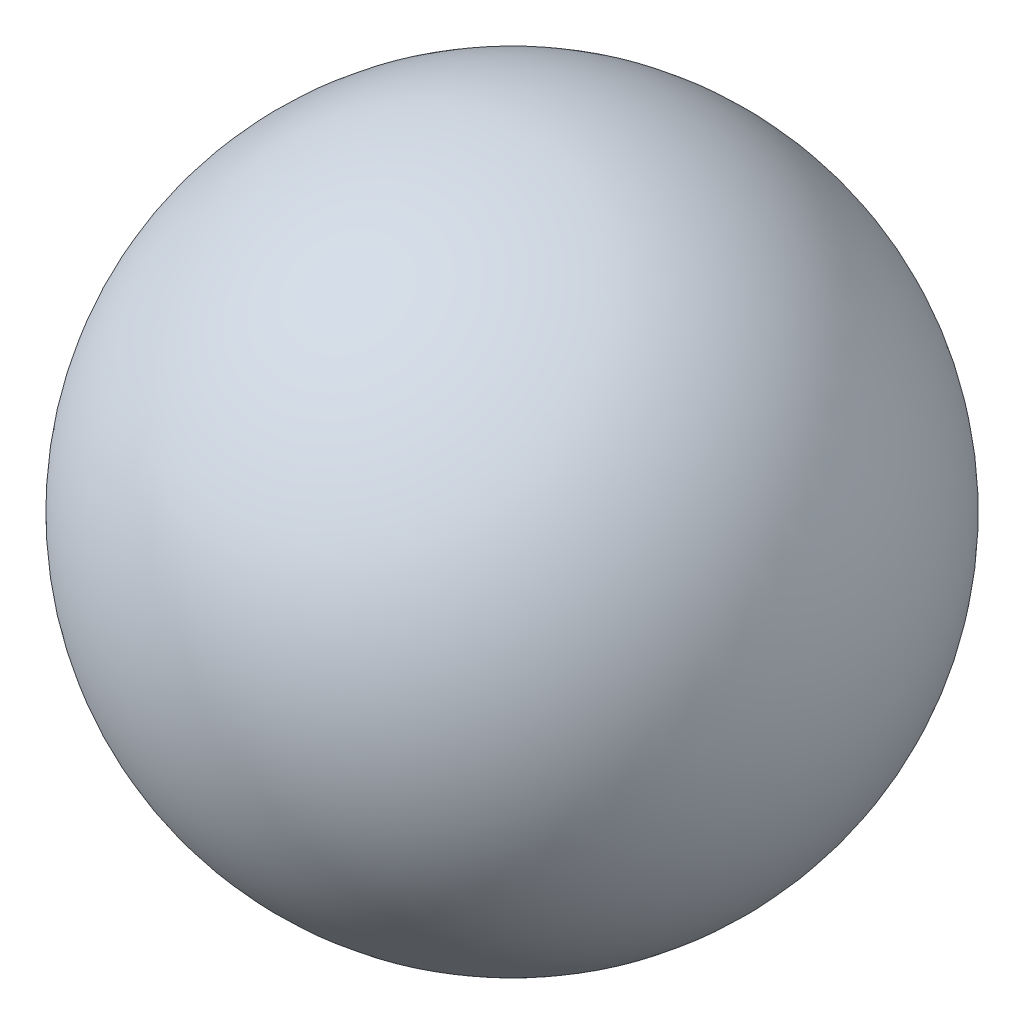
ISO-10303-21;
HEADER;
FILE_DESCRIPTION(('STEP AP214'),'2;1');
FILE_NAME('part.step','',(''),(''),'','','');
FILE_SCHEMA(('AUTOMOTIVE_DESIGN { 1 0 10303 214 1 1 1 1 }'));
ENDSEC;
DATA;
#1=APPLICATION_CONTEXT('core data for automotive mechanical design processes');
#2=APPLICATION_PROTOCOL_DEFINITION('international standard','automotive_design',2000,#1);
#3=PRODUCT_CONTEXT('',#1,'mechanical');
#4=PRODUCT('Part','Part','',(#3));
#5=PRODUCT_RELATED_PRODUCT_CATEGORY('part','',(#4));
#6=PRODUCT_DEFINITION_FORMATION('','',#4);
#7=PRODUCT_DEFINITION_CONTEXT('part definition',#1,'design');
#8=PRODUCT_DEFINITION('design','',#6,#7);
#9=PRODUCT_DEFINITION_SHAPE('','',#8);
#10=(LENGTH_UNIT() NAMED_UNIT(*) SI_UNIT(.MILLI.,.METRE.));
#11=(NAMED_UNIT(*) PLANE_ANGLE_UNIT() SI_UNIT($,.RADIAN.));
#12=(NAMED_UNIT(*) SI_UNIT($,.STERADIAN.) SOLID_ANGLE_UNIT());
#13=UNCERTAINTY_MEASURE_WITH_UNIT(LENGTH_MEASURE(1.E-05),#10,'distance_accuracy_value','');
#14=(GEOMETRIC_REPRESENTATION_CONTEXT(3) GLOBAL_UNCERTAINTY_ASSIGNED_CONTEXT((#13)) GLOBAL_UNIT_ASSIGNED_CONTEXT((#10,
#11,#12)) REPRESENTATION_CONTEXT('',''));
#15=CARTESIAN_POINT('',(0.,0.,0.));
#16=DIRECTION('',(0.,0.,1.));
#17=DIRECTION('',(1.,0.,0.));
#18=AXIS2_PLACEMENT_3D('',#15,#16,#17);
#19=CARTESIAN_POINT('',(0.,0.,0.));
#20=DIRECTION('',(0.,1.,0.));
#21=DIRECTION('',(1.,0.,0.));
#22=AXIS2_PLACEMENT_3D('',#19,#20,#21);
#23=SPHERICAL_SURFACE('',#22,12.);
#24=CARTESIAN_POINT('',(0.,12.,0.));
#25=VERTEX_POINT('',#24);
#26=VERTEX_LOOP('',#25);
#27=FACE_BOUND('',#26,.T.);
#28=ADVANCED_FACE('F41',(#27),#23,.T.);
#29=CLOSED_SHELL('',(#28));
#30=MANIFOLD_SOLID_BREP('B2',#29);
#31=ADVANCED_BREP_SHAPE_REPRESENTATION('',(#18,#30),#14);
#32=SHAPE_DEFINITION_REPRESENTATION(#9,#31);
ENDSEC;
END-ISO-10303-21;
